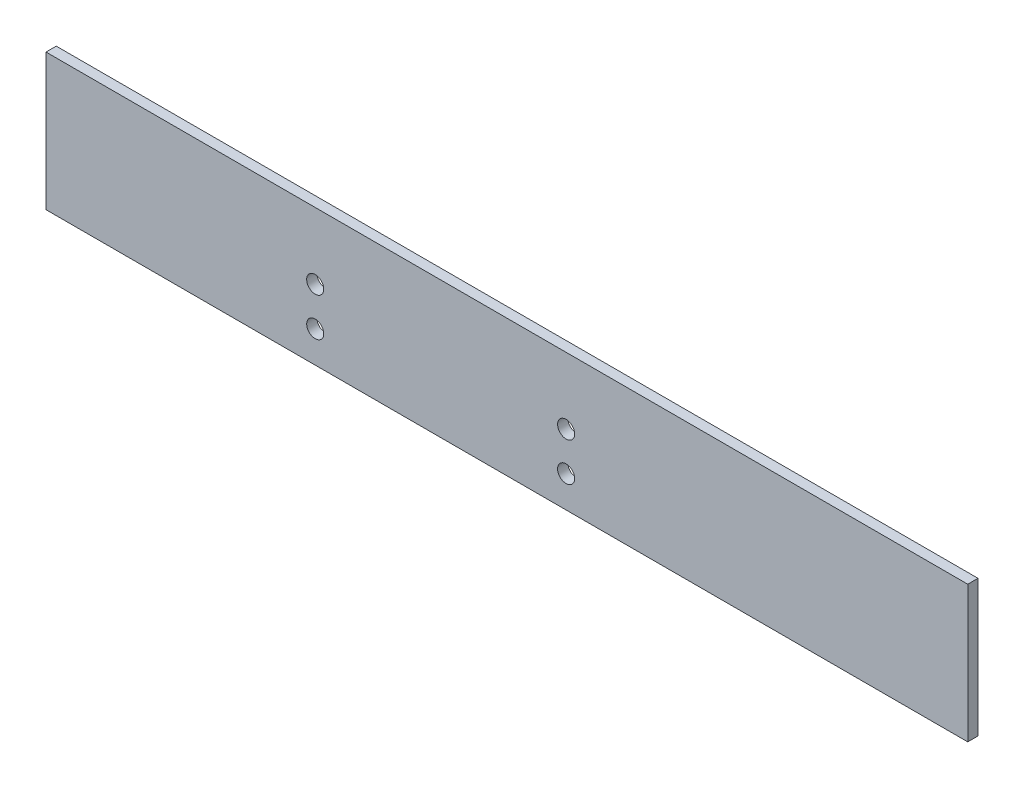
ISO-10303-21;
HEADER;
FILE_DESCRIPTION(('STEP AP214'),'2;1');
FILE_NAME('part.step','',(''),(''),'','','');
FILE_SCHEMA(('AUTOMOTIVE_DESIGN { 1 0 10303 214 1 1 1 1 }'));
ENDSEC;
DATA;
#1=APPLICATION_CONTEXT('core data for automotive mechanical design processes');
#2=APPLICATION_PROTOCOL_DEFINITION('international standard','automotive_design',2000,#1);
#3=PRODUCT_CONTEXT('',#1,'mechanical');
#4=PRODUCT('Part','Part','',(#3));
#5=PRODUCT_RELATED_PRODUCT_CATEGORY('part','',(#4));
#6=PRODUCT_DEFINITION_FORMATION('','',#4);
#7=PRODUCT_DEFINITION_CONTEXT('part definition',#1,'design');
#8=PRODUCT_DEFINITION('design','',#6,#7);
#9=PRODUCT_DEFINITION_SHAPE('','',#8);
#10=(LENGTH_UNIT() NAMED_UNIT(*) SI_UNIT(.MILLI.,.METRE.));
#11=(NAMED_UNIT(*) PLANE_ANGLE_UNIT() SI_UNIT($,.RADIAN.));
#12=(NAMED_UNIT(*) SI_UNIT($,.STERADIAN.) SOLID_ANGLE_UNIT());
#13=UNCERTAINTY_MEASURE_WITH_UNIT(LENGTH_MEASURE(1.E-05),#10,'distance_accuracy_value','');
#14=(GEOMETRIC_REPRESENTATION_CONTEXT(3) GLOBAL_UNCERTAINTY_ASSIGNED_CONTEXT((#13)) GLOBAL_UNIT_ASSIGNED_CONTEXT((#10,
#11,#12)) REPRESENTATION_CONTEXT('',''));
#15=CARTESIAN_POINT('',(0.,0.,0.));
#16=DIRECTION('',(0.,0.,1.));
#17=DIRECTION('',(1.,0.,0.));
#18=AXIS2_PLACEMENT_3D('',#15,#16,#17);
#19=CARTESIAN_POINT('',(0.,0.,3.));
#20=DIRECTION('',(0.,0.,1.));
#21=DIRECTION('',(1.,0.,0.));
#22=AXIS2_PLACEMENT_3D('',#19,#20,#21);
#23=PLANE('',#22);
#24=CARTESIAN_POINT('',(152.353329829675,-19.4999999999998,3.));
#25=DIRECTION('',(0.,0.,1.));
#26=DIRECTION('',(1.,0.,0.));
#27=AXIS2_PLACEMENT_3D('',#24,#25,#26);
#28=CIRCLE('',#27,2.5);
#29=CARTESIAN_POINT('',(154.853329829675,-19.4999999999998,3.));
#30=VERTEX_POINT('',#29);
#31=EDGE_CURVE('E131',#30,#30,#28,.T.);
#32=ORIENTED_EDGE('',*,*,#31,.F.);
#33=EDGE_LOOP('',(#32));
#34=FACE_BOUND('',#33,.T.);
#35=CARTESIAN_POINT('',(78.8545607251824,-19.4999999999999,3.));
#36=DIRECTION('',(0.,0.,1.));
#37=DIRECTION('',(1.,0.,0.));
#38=AXIS2_PLACEMENT_3D('',#35,#36,#37);
#39=CIRCLE('',#38,2.5);
#40=CARTESIAN_POINT('',(81.3545607251824,-19.4999999999999,3.));
#41=VERTEX_POINT('',#40);
#42=EDGE_CURVE('E110',#41,#41,#39,.T.);
#43=ORIENTED_EDGE('',*,*,#42,.F.);
#44=EDGE_LOOP('',(#43));
#45=FACE_BOUND('',#44,.T.);
#46=DIRECTION('',(0.,-1.,0.));
#47=VECTOR('',#46,1.);
#48=CARTESIAN_POINT('',(0.,0.,3.));
#49=LINE('',#48,#47);
#50=CARTESIAN_POINT('',(0.,0.,3.));
#51=VERTEX_POINT('',#50);
#52=CARTESIAN_POINT('',(0.,-40.,3.));
#53=VERTEX_POINT('',#52);
#54=EDGE_CURVE('E95',#51,#53,#49,.T.);
#55=ORIENTED_EDGE('',*,*,#54,.T.);
#56=DIRECTION('',(1.,0.,0.));
#57=VECTOR('',#56,1.);
#58=CARTESIAN_POINT('',(0.,-40.,3.));
#59=LINE('',#58,#57);
#60=CARTESIAN_POINT('',(270.,-40.,3.));
#61=VERTEX_POINT('',#60);
#62=EDGE_CURVE('E90',#53,#61,#59,.T.);
#63=ORIENTED_EDGE('',*,*,#62,.T.);
#64=DIRECTION('',(0.,1.,0.));
#65=VECTOR('',#64,1.);
#66=CARTESIAN_POINT('',(270.,0.,3.));
#67=LINE('',#66,#65);
#68=CARTESIAN_POINT('',(270.,0.,3.));
#69=VERTEX_POINT('',#68);
#70=EDGE_CURVE('E93',#61,#69,#67,.T.);
#71=ORIENTED_EDGE('',*,*,#70,.T.);
#72=DIRECTION('',(-1.,0.,0.));
#73=VECTOR('',#72,1.);
#74=CARTESIAN_POINT('',(0.,0.,3.));
#75=LINE('',#74,#73);
#76=EDGE_CURVE('E60',#69,#51,#75,.T.);
#77=ORIENTED_EDGE('',*,*,#76,.T.);
#78=EDGE_LOOP('',(#55,#63,#71,#77));
#79=FACE_BOUND('',#78,.T.);
#80=CARTESIAN_POINT('',(78.8545607251824,-30.7999999999999,3.));
#81=DIRECTION('',(0.,0.,1.));
#82=DIRECTION('',(1.,0.,0.));
#83=AXIS2_PLACEMENT_3D('',#80,#81,#82);
#84=CIRCLE('',#83,2.50000000000001);
#85=CARTESIAN_POINT('',(81.3545607251824,-30.7999999999999,3.));
#86=VERTEX_POINT('',#85);
#87=EDGE_CURVE('E125',#86,#86,#84,.T.);
#88=ORIENTED_EDGE('',*,*,#87,.F.);
#89=EDGE_LOOP('',(#88));
#90=FACE_BOUND('',#89,.T.);
#91=CARTESIAN_POINT('',(152.353329829675,-30.7999999999998,3.));
#92=DIRECTION('',(0.,0.,1.));
#93=DIRECTION('',(1.,0.,0.));
#94=AXIS2_PLACEMENT_3D('',#91,#92,#93);
#95=CIRCLE('',#94,2.5);
#96=CARTESIAN_POINT('',(154.853329829675,-30.7999999999998,3.));
#97=VERTEX_POINT('',#96);
#98=EDGE_CURVE('E137',#97,#97,#95,.T.);
#99=ORIENTED_EDGE('',*,*,#98,.F.);
#100=EDGE_LOOP('',(#99));
#101=FACE_BOUND('',#100,.T.);
#102=ADVANCED_FACE('F43',(#34,#45,#79,#90,#101),#23,.T.);
#103=CARTESIAN_POINT('',(0.,0.,0.));
#104=DIRECTION('',(0.,0.,1.));
#105=DIRECTION('',(1.,0.,0.));
#106=AXIS2_PLACEMENT_3D('',#103,#104,#105);
#107=PLANE('',#106);
#108=DIRECTION('',(0.,-1.,0.));
#109=VECTOR('',#108,1.);
#110=CARTESIAN_POINT('',(0.,0.,0.));
#111=LINE('',#110,#109);
#112=CARTESIAN_POINT('',(0.,0.,0.));
#113=VERTEX_POINT('',#112);
#114=CARTESIAN_POINT('',(0.,-40.,0.));
#115=VERTEX_POINT('',#114);
#116=EDGE_CURVE('E107',#113,#115,#111,.T.);
#117=ORIENTED_EDGE('',*,*,#116,.F.);
#118=DIRECTION('',(-1.,0.,0.));
#119=VECTOR('',#118,1.);
#120=CARTESIAN_POINT('',(0.,0.,0.));
#121=LINE('',#120,#119);
#122=CARTESIAN_POINT('',(270.,0.,0.));
#123=VERTEX_POINT('',#122);
#124=EDGE_CURVE('E83',#123,#113,#121,.T.);
#125=ORIENTED_EDGE('',*,*,#124,.F.);
#126=DIRECTION('',(0.,1.,0.));
#127=VECTOR('',#126,1.);
#128=CARTESIAN_POINT('',(270.,0.,0.));
#129=LINE('',#128,#127);
#130=CARTESIAN_POINT('',(270.,-40.,0.));
#131=VERTEX_POINT('',#130);
#132=EDGE_CURVE('E77',#131,#123,#129,.T.);
#133=ORIENTED_EDGE('',*,*,#132,.F.);
#134=DIRECTION('',(1.,0.,0.));
#135=VECTOR('',#134,1.);
#136=CARTESIAN_POINT('',(0.,-40.,0.));
#137=LINE('',#136,#135);
#138=EDGE_CURVE('E99',#115,#131,#137,.T.);
#139=ORIENTED_EDGE('',*,*,#138,.F.);
#140=EDGE_LOOP('',(#117,#125,#133,#139));
#141=FACE_BOUND('',#140,.T.);
#142=CARTESIAN_POINT('',(78.8545607251824,-19.4999999999999,0.));
#143=DIRECTION('',(0.,0.,1.));
#144=DIRECTION('',(1.,0.,0.));
#145=AXIS2_PLACEMENT_3D('',#142,#143,#144);
#146=CIRCLE('',#145,2.5);
#147=CARTESIAN_POINT('',(81.3545607251824,-19.4999999999999,0.));
#148=VERTEX_POINT('',#147);
#149=EDGE_CURVE('E122',#148,#148,#146,.T.);
#150=ORIENTED_EDGE('',*,*,#149,.T.);
#151=EDGE_LOOP('',(#150));
#152=FACE_BOUND('',#151,.T.);
#153=CARTESIAN_POINT('',(78.8545607251824,-30.7999999999999,0.));
#154=DIRECTION('',(0.,0.,1.));
#155=DIRECTION('',(1.,0.,0.));
#156=AXIS2_PLACEMENT_3D('',#153,#154,#155);
#157=CIRCLE('',#156,2.50000000000001);
#158=CARTESIAN_POINT('',(81.3545607251824,-30.7999999999999,0.));
#159=VERTEX_POINT('',#158);
#160=EDGE_CURVE('E128',#159,#159,#157,.T.);
#161=ORIENTED_EDGE('',*,*,#160,.T.);
#162=EDGE_LOOP('',(#161));
#163=FACE_BOUND('',#162,.T.);
#164=CARTESIAN_POINT('',(152.353329829675,-19.4999999999998,0.));
#165=DIRECTION('',(0.,0.,1.));
#166=DIRECTION('',(1.,0.,0.));
#167=AXIS2_PLACEMENT_3D('',#164,#165,#166);
#168=CIRCLE('',#167,2.5);
#169=CARTESIAN_POINT('',(154.853329829675,-19.4999999999998,0.));
#170=VERTEX_POINT('',#169);
#171=EDGE_CURVE('E134',#170,#170,#168,.T.);
#172=ORIENTED_EDGE('',*,*,#171,.T.);
#173=EDGE_LOOP('',(#172));
#174=FACE_BOUND('',#173,.T.);
#175=CARTESIAN_POINT('',(152.353329829675,-30.7999999999998,0.));
#176=DIRECTION('',(0.,0.,1.));
#177=DIRECTION('',(1.,0.,0.));
#178=AXIS2_PLACEMENT_3D('',#175,#176,#177);
#179=CIRCLE('',#178,2.5);
#180=CARTESIAN_POINT('',(154.853329829675,-30.7999999999998,0.));
#181=VERTEX_POINT('',#180);
#182=EDGE_CURVE('E140',#181,#181,#179,.T.);
#183=ORIENTED_EDGE('',*,*,#182,.T.);
#184=EDGE_LOOP('',(#183));
#185=FACE_BOUND('',#184,.T.);
#186=ADVANCED_FACE('F118',(#141,#152,#163,#174,#185),#107,.F.);
#187=CARTESIAN_POINT('',(0.,0.,3.));
#188=DIRECTION('',(1.,0.,0.));
#189=DIRECTION('',(0.,1.,0.));
#190=AXIS2_PLACEMENT_3D('',#187,#188,#189);
#191=PLANE('',#190);
#192=ORIENTED_EDGE('',*,*,#116,.T.);
#193=DIRECTION('',(0.,0.,-1.));
#194=VECTOR('',#193,1.);
#195=CARTESIAN_POINT('',(0.,-40.,3.));
#196=LINE('',#195,#194);
#197=EDGE_CURVE('E13',#53,#115,#196,.T.);
#198=ORIENTED_EDGE('',*,*,#197,.F.);
#199=ORIENTED_EDGE('',*,*,#54,.F.);
#200=DIRECTION('',(0.,0.,-1.));
#201=VECTOR('',#200,1.);
#202=CARTESIAN_POINT('',(0.,0.,3.));
#203=LINE('',#202,#201);
#204=EDGE_CURVE('E103',#51,#113,#203,.T.);
#205=ORIENTED_EDGE('',*,*,#204,.T.);
#206=EDGE_LOOP('',(#192,#198,#199,#205));
#207=FACE_BOUND('',#206,.T.);
#208=ADVANCED_FACE('F45',(#207),#191,.F.);
#209=CARTESIAN_POINT('',(0.,-40.,3.));
#210=DIRECTION('',(0.,1.,0.));
#211=DIRECTION('',(0.,0.,1.));
#212=AXIS2_PLACEMENT_3D('',#209,#210,#211);
#213=PLANE('',#212);
#214=ORIENTED_EDGE('',*,*,#138,.T.);
#215=DIRECTION('',(0.,0.,-1.));
#216=VECTOR('',#215,1.);
#217=CARTESIAN_POINT('',(270.,-40.,3.));
#218=LINE('',#217,#216);
#219=EDGE_CURVE('E52',#61,#131,#218,.T.);
#220=ORIENTED_EDGE('',*,*,#219,.F.);
#221=ORIENTED_EDGE('',*,*,#62,.F.);
#222=ORIENTED_EDGE('',*,*,#197,.T.);
#223=EDGE_LOOP('',(#214,#220,#221,#222));
#224=FACE_BOUND('',#223,.T.);
#225=ADVANCED_FACE('F98',(#224),#213,.F.);
#226=CARTESIAN_POINT('',(270.,0.,3.));
#227=DIRECTION('',(-1.,0.,0.));
#228=DIRECTION('',(0.,0.,1.));
#229=AXIS2_PLACEMENT_3D('',#226,#227,#228);
#230=PLANE('',#229);
#231=ORIENTED_EDGE('',*,*,#132,.T.);
#232=DIRECTION('',(0.,0.,-1.));
#233=VECTOR('',#232,1.);
#234=CARTESIAN_POINT('',(270.,0.,3.));
#235=LINE('',#234,#233);
#236=EDGE_CURVE('E100',#69,#123,#235,.T.);
#237=ORIENTED_EDGE('',*,*,#236,.F.);
#238=ORIENTED_EDGE('',*,*,#70,.F.);
#239=ORIENTED_EDGE('',*,*,#219,.T.);
#240=EDGE_LOOP('',(#231,#237,#238,#239));
#241=FACE_BOUND('',#240,.T.);
#242=ADVANCED_FACE('F101',(#241),#230,.F.);
#243=CARTESIAN_POINT('',(0.,0.,3.));
#244=DIRECTION('',(0.,-1.,0.));
#245=DIRECTION('',(0.,0.,-1.));
#246=AXIS2_PLACEMENT_3D('',#243,#244,#245);
#247=PLANE('',#246);
#248=ORIENTED_EDGE('',*,*,#124,.T.);
#249=ORIENTED_EDGE('',*,*,#204,.F.);
#250=ORIENTED_EDGE('',*,*,#76,.F.);
#251=ORIENTED_EDGE('',*,*,#236,.T.);
#252=EDGE_LOOP('',(#248,#249,#250,#251));
#253=FACE_BOUND('',#252,.T.);
#254=ADVANCED_FACE('F115',(#253),#247,.F.);
#255=CARTESIAN_POINT('',(78.8545607251824,-19.4999999999999,3.));
#256=DIRECTION('',(0.,0.,-1.));
#257=DIRECTION('',(-1.,0.,0.));
#258=AXIS2_PLACEMENT_3D('',#255,#256,#257);
#259=CYLINDRICAL_SURFACE('',#258,2.5);
#260=ORIENTED_EDGE('',*,*,#42,.T.);
#261=EDGE_LOOP('',(#260));
#262=FACE_BOUND('',#261,.T.);
#263=ORIENTED_EDGE('',*,*,#149,.F.);
#264=EDGE_LOOP('',(#263));
#265=FACE_BOUND('',#264,.T.);
#266=ADVANCED_FACE('F159',(#262,#265),#259,.F.);
#267=CARTESIAN_POINT('',(78.8545607251824,-30.7999999999999,3.));
#268=DIRECTION('',(0.,0.,-1.));
#269=DIRECTION('',(-1.,0.,0.));
#270=AXIS2_PLACEMENT_3D('',#267,#268,#269);
#271=CYLINDRICAL_SURFACE('',#270,2.50000000000001);
#272=ORIENTED_EDGE('',*,*,#87,.T.);
#273=EDGE_LOOP('',(#272));
#274=FACE_BOUND('',#273,.T.);
#275=ORIENTED_EDGE('',*,*,#160,.F.);
#276=EDGE_LOOP('',(#275));
#277=FACE_BOUND('',#276,.T.);
#278=ADVANCED_FACE('F205',(#274,#277),#271,.F.);
#279=CARTESIAN_POINT('',(152.353329829675,-19.4999999999998,3.));
#280=DIRECTION('',(0.,0.,-1.));
#281=DIRECTION('',(-1.,0.,0.));
#282=AXIS2_PLACEMENT_3D('',#279,#280,#281);
#283=CYLINDRICAL_SURFACE('',#282,2.5);
#284=ORIENTED_EDGE('',*,*,#31,.T.);
#285=EDGE_LOOP('',(#284));
#286=FACE_BOUND('',#285,.T.);
#287=ORIENTED_EDGE('',*,*,#171,.F.);
#288=EDGE_LOOP('',(#287));
#289=FACE_BOUND('',#288,.T.);
#290=ADVANCED_FACE('F213',(#286,#289),#283,.F.);
#291=CARTESIAN_POINT('',(152.353329829675,-30.7999999999998,3.));
#292=DIRECTION('',(0.,0.,-1.));
#293=DIRECTION('',(-1.,0.,0.));
#294=AXIS2_PLACEMENT_3D('',#291,#292,#293);
#295=CYLINDRICAL_SURFACE('',#294,2.5);
#296=ORIENTED_EDGE('',*,*,#98,.T.);
#297=EDGE_LOOP('',(#296));
#298=FACE_BOUND('',#297,.T.);
#299=ORIENTED_EDGE('',*,*,#182,.F.);
#300=EDGE_LOOP('',(#299));
#301=FACE_BOUND('',#300,.T.);
#302=ADVANCED_FACE('F146',(#298,#301),#295,.F.);
#303=CLOSED_SHELL('',(#102,#186,#208,#225,#242,#254,#266,#278,#290,#302));
#304=MANIFOLD_SOLID_BREP('B2',#303);
#305=ADVANCED_BREP_SHAPE_REPRESENTATION('',(#18,#304),#14);
#306=SHAPE_DEFINITION_REPRESENTATION(#9,#305);
ENDSEC;
END-ISO-10303-21;
